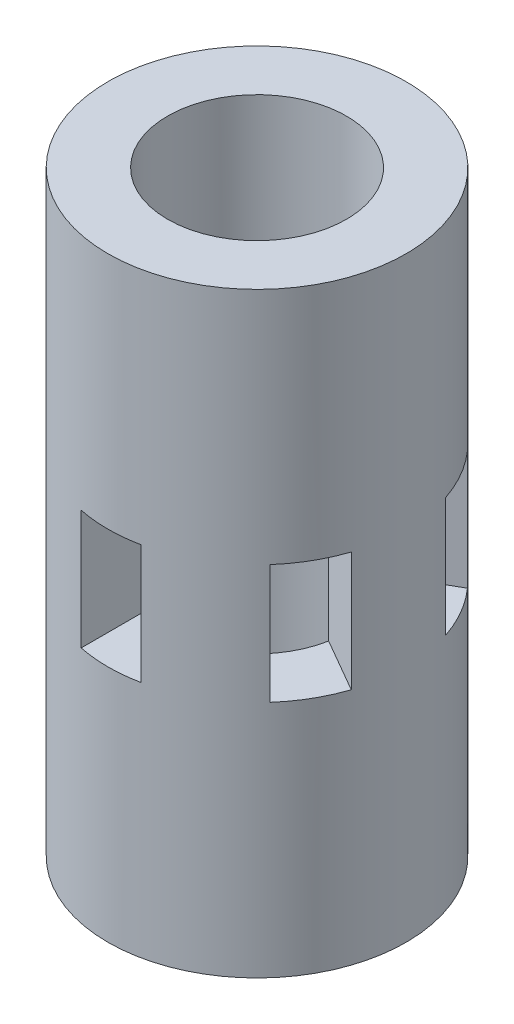
ISO-10303-21;
HEADER;
FILE_DESCRIPTION(('STEP AP214'),'2;1');
FILE_NAME('part.step','',(''),(''),'','','');
FILE_SCHEMA(('AUTOMOTIVE_DESIGN { 1 0 10303 214 1 1 1 1 }'));
ENDSEC;
DATA;
#1=APPLICATION_CONTEXT('core data for automotive mechanical design processes');
#2=APPLICATION_PROTOCOL_DEFINITION('international standard','automotive_design',2000,#1);
#3=PRODUCT_CONTEXT('',#1,'mechanical');
#4=PRODUCT('Part','Part','',(#3));
#5=PRODUCT_RELATED_PRODUCT_CATEGORY('part','',(#4));
#6=PRODUCT_DEFINITION_FORMATION('','',#4);
#7=PRODUCT_DEFINITION_CONTEXT('part definition',#1,'design');
#8=PRODUCT_DEFINITION('design','',#6,#7);
#9=PRODUCT_DEFINITION_SHAPE('','',#8);
#10=(LENGTH_UNIT() NAMED_UNIT(*) SI_UNIT(.MILLI.,.METRE.));
#11=(NAMED_UNIT(*) PLANE_ANGLE_UNIT() SI_UNIT($,.RADIAN.));
#12=(NAMED_UNIT(*) SI_UNIT($,.STERADIAN.) SOLID_ANGLE_UNIT());
#13=UNCERTAINTY_MEASURE_WITH_UNIT(LENGTH_MEASURE(1.E-05),#10,'distance_accuracy_value','');
#14=(GEOMETRIC_REPRESENTATION_CONTEXT(3) GLOBAL_UNCERTAINTY_ASSIGNED_CONTEXT((#13)) GLOBAL_UNIT_ASSIGNED_CONTEXT((#10,
#11,#12)) REPRESENTATION_CONTEXT('',''));
#15=CARTESIAN_POINT('',(0.,0.,0.));
#16=DIRECTION('',(0.,0.,1.));
#17=DIRECTION('',(1.,0.,0.));
#18=AXIS2_PLACEMENT_3D('',#15,#16,#17);
#19=CARTESIAN_POINT('',(0.,56.451612903226,0.));
#20=DIRECTION('',(0.,1.,0.));
#21=DIRECTION('',(0.,0.,1.));
#22=AXIS2_PLACEMENT_3D('',#19,#20,#21);
#23=CYLINDRICAL_SURFACE('',#22,25.);
#24=CARTESIAN_POINT('',(0.,-10.,0.));
#25=DIRECTION('',(0.,-1.,0.));
#26=DIRECTION('',(0.,0.,-1.));
#27=AXIS2_PLACEMENT_3D('',#24,#25,#26);
#28=CIRCLE('',#27,25.);
#29=CARTESIAN_POINT('',(-18.7132034355965,-10.,-16.577575732838));
#30=VERTEX_POINT('',#29);
#31=CARTESIAN_POINT('',(-23.7132034355964,-10.,-7.91732169499363));
#32=VERTEX_POINT('',#31);
#33=EDGE_CURVE('E272',#30,#32,#28,.F.);
#34=ORIENTED_EDGE('',*,*,#33,.F.);
#35=DIRECTION('',(0.,1.,0.));
#36=VECTOR('',#35,1.);
#37=CARTESIAN_POINT('',(-18.7132034355965,56.451612903226,-16.577575732838));
#38=LINE('',#37,#36);
#39=CARTESIAN_POINT('',(-18.7132034355965,10.,-16.577575732838));
#40=VERTEX_POINT('',#39);
#41=EDGE_CURVE('E315',#40,#30,#38,.F.);
#42=ORIENTED_EDGE('',*,*,#41,.F.);
#43=CARTESIAN_POINT('',(0.,10.,0.));
#44=DIRECTION('',(0.,1.,0.));
#45=DIRECTION('',(0.,0.,1.));
#46=AXIS2_PLACEMENT_3D('',#43,#44,#45);
#47=CIRCLE('',#46,25.);
#48=CARTESIAN_POINT('',(-23.7132034355965,10.,-7.91732169499364));
#49=VERTEX_POINT('',#48);
#50=EDGE_CURVE('E288',#49,#40,#47,.F.);
#51=ORIENTED_EDGE('',*,*,#50,.F.);
#52=DIRECTION('',(0.,1.,0.));
#53=VECTOR('',#52,1.);
#54=CARTESIAN_POINT('',(-23.7132034355964,56.451612903226,-7.91732169499363));
#55=LINE('',#54,#53);
#56=EDGE_CURVE('E309',#32,#49,#55,.T.);
#57=ORIENTED_EDGE('',*,*,#56,.F.);
#58=EDGE_LOOP('',(#34,#42,#51,#57));
#59=FACE_BOUND('',#58,.T.);
#60=DIRECTION('',(0.,1.,0.));
#61=VECTOR('',#60,1.);
#62=CARTESIAN_POINT('',(-23.7132034355964,56.451612903226,7.91732169499382));
#63=LINE('',#62,#61);
#64=CARTESIAN_POINT('',(-23.7132034355964,10.,7.91732169499381));
#65=VERTEX_POINT('',#64);
#66=CARTESIAN_POINT('',(-23.7132034355964,-10.,7.9173216949938));
#67=VERTEX_POINT('',#66);
#68=EDGE_CURVE('E305',#65,#67,#63,.F.);
#69=ORIENTED_EDGE('',*,*,#68,.F.);
#70=CARTESIAN_POINT('',(-18.7132034355963,10.,16.5775757328382));
#71=VERTEX_POINT('',#70);
#72=EDGE_CURVE('E314',#71,#65,#47,.F.);
#73=ORIENTED_EDGE('',*,*,#72,.F.);
#74=DIRECTION('',(0.,1.,0.));
#75=VECTOR('',#74,1.);
#76=CARTESIAN_POINT('',(-18.7132034355963,56.451612903226,16.5775757328382));
#77=LINE('',#76,#75);
#78=CARTESIAN_POINT('',(-18.7132034355963,-10.,16.5775757328382));
#79=VERTEX_POINT('',#78);
#80=EDGE_CURVE('E303',#79,#71,#77,.T.);
#81=ORIENTED_EDGE('',*,*,#80,.F.);
#82=EDGE_CURVE('E823',#67,#79,#28,.F.);
#83=ORIENTED_EDGE('',*,*,#82,.F.);
#84=EDGE_LOOP('',(#69,#73,#81,#83));
#85=FACE_BOUND('',#84,.T.);
#86=DIRECTION('',(0.,1.,0.));
#87=VECTOR('',#86,1.);
#88=CARTESIAN_POINT('',(-4.99999999999999,56.451612903226,24.4948974278318));
#89=LINE('',#88,#87);
#90=CARTESIAN_POINT('',(-5.,10.,24.4948974278318));
#91=VERTEX_POINT('',#90);
#92=CARTESIAN_POINT('',(-5.,-10.,24.4948974278318));
#93=VERTEX_POINT('',#92);
#94=EDGE_CURVE('E301',#91,#93,#89,.F.);
#95=ORIENTED_EDGE('',*,*,#94,.F.);
#96=CARTESIAN_POINT('',(5.,10.,24.4948974278318));
#97=VERTEX_POINT('',#96);
#98=EDGE_CURVE('E311',#97,#91,#47,.F.);
#99=ORIENTED_EDGE('',*,*,#98,.F.);
#100=DIRECTION('',(0.,1.,0.));
#101=VECTOR('',#100,1.);
#102=CARTESIAN_POINT('',(5.00000000000001,56.451612903226,24.4948974278318));
#103=LINE('',#102,#101);
#104=CARTESIAN_POINT('',(5.00000000000001,-10.,24.4948974278318));
#105=VERTEX_POINT('',#104);
#106=EDGE_CURVE('E299',#105,#97,#103,.T.);
#107=ORIENTED_EDGE('',*,*,#106,.F.);
#108=EDGE_CURVE('E463',#93,#105,#28,.F.);
#109=ORIENTED_EDGE('',*,*,#108,.F.);
#110=EDGE_LOOP('',(#95,#99,#107,#109));
#111=FACE_BOUND('',#110,.T.);
#112=DIRECTION('',(0.,1.,0.));
#113=VECTOR('',#112,1.);
#114=CARTESIAN_POINT('',(18.7132034355966,56.451612903226,16.5775757328379));
#115=LINE('',#114,#113);
#116=CARTESIAN_POINT('',(18.7132034355966,10.,16.5775757328379));
#117=VERTEX_POINT('',#116);
#118=CARTESIAN_POINT('',(18.7132034355966,-10.,16.5775757328379));
#119=VERTEX_POINT('',#118);
#120=EDGE_CURVE('E297',#117,#119,#115,.F.);
#121=ORIENTED_EDGE('',*,*,#120,.F.);
#122=CARTESIAN_POINT('',(23.7132034355965,10.,7.91732169499347));
#123=VERTEX_POINT('',#122);
#124=EDGE_CURVE('E313',#123,#117,#47,.F.);
#125=ORIENTED_EDGE('',*,*,#124,.F.);
#126=DIRECTION('',(0.,1.,0.));
#127=VECTOR('',#126,1.);
#128=CARTESIAN_POINT('',(23.7132034355965,56.451612903226,7.91732169499346));
#129=LINE('',#128,#127);
#130=CARTESIAN_POINT('',(23.7132034355965,-10.,7.91732169499346));
#131=VERTEX_POINT('',#130);
#132=EDGE_CURVE('E295',#131,#123,#129,.T.);
#133=ORIENTED_EDGE('',*,*,#132,.F.);
#134=EDGE_CURVE('E319',#119,#131,#28,.F.);
#135=ORIENTED_EDGE('',*,*,#134,.F.);
#136=EDGE_LOOP('',(#121,#125,#133,#135));
#137=FACE_BOUND('',#136,.T.);
#138=DIRECTION('',(0.,1.,0.));
#139=VECTOR('',#138,1.);
#140=CARTESIAN_POINT('',(18.7132034355964,56.451612903226,-16.5775757328382));
#141=LINE('',#140,#139);
#142=CARTESIAN_POINT('',(18.7132034355964,-10.,-16.5775757328382));
#143=VERTEX_POINT('',#142);
#144=CARTESIAN_POINT('',(18.7132034355964,10.,-16.5775757328382));
#145=VERTEX_POINT('',#144);
#146=EDGE_CURVE('E307',#143,#145,#141,.T.);
#147=ORIENTED_EDGE('',*,*,#146,.F.);
#148=CARTESIAN_POINT('',(23.7132034355963,-10.,-7.91732169499397));
#149=VERTEX_POINT('',#148);
#150=EDGE_CURVE('E317',#149,#143,#28,.F.);
#151=ORIENTED_EDGE('',*,*,#150,.F.);
#152=DIRECTION('',(0.,1.,0.));
#153=VECTOR('',#152,1.);
#154=CARTESIAN_POINT('',(23.7132034355963,56.451612903226,-7.91732169499399));
#155=LINE('',#154,#153);
#156=CARTESIAN_POINT('',(23.7132034355963,10.,-7.91732169499399));
#157=VERTEX_POINT('',#156);
#158=EDGE_CURVE('E274',#157,#149,#155,.F.);
#159=ORIENTED_EDGE('',*,*,#158,.F.);
#160=EDGE_CURVE('E214',#145,#157,#47,.F.);
#161=ORIENTED_EDGE('',*,*,#160,.F.);
#162=EDGE_LOOP('',(#147,#151,#159,#161));
#163=FACE_BOUND('',#162,.T.);
#164=CARTESIAN_POINT('',(0.,-10.,0.));
#165=DIRECTION('',(0.,-1.,0.));
#166=DIRECTION('',(0.,0.,-1.));
#167=AXIS2_PLACEMENT_3D('',#164,#165,#166);
#168=CIRCLE('',#167,25.);
#169=CARTESIAN_POINT('',(5.,-10.,-24.4948974278318));
#170=VERTEX_POINT('',#169);
#171=CARTESIAN_POINT('',(-5.00000000000001,-10.,-24.4948974278318));
#172=VERTEX_POINT('',#171);
#173=EDGE_CURVE('E337',#170,#172,#168,.F.);
#174=ORIENTED_EDGE('',*,*,#173,.F.);
#175=DIRECTION('',(0.,1.,0.));
#176=VECTOR('',#175,1.);
#177=CARTESIAN_POINT('',(4.99999999999999,56.451612903226,-24.4948974278318));
#178=LINE('',#177,#176);
#179=CARTESIAN_POINT('',(5.,10.,-24.4948974278318));
#180=VERTEX_POINT('',#179);
#181=EDGE_CURVE('E335',#180,#170,#178,.F.);
#182=ORIENTED_EDGE('',*,*,#181,.F.);
#183=CARTESIAN_POINT('',(0.,10.,0.));
#184=DIRECTION('',(0.,1.,0.));
#185=DIRECTION('',(0.,0.,1.));
#186=AXIS2_PLACEMENT_3D('',#183,#184,#185);
#187=CIRCLE('',#186,25.);
#188=CARTESIAN_POINT('',(-5.,10.,-24.4948974278318));
#189=VERTEX_POINT('',#188);
#190=EDGE_CURVE('E333',#189,#180,#187,.F.);
#191=ORIENTED_EDGE('',*,*,#190,.F.);
#192=DIRECTION('',(0.,1.,0.));
#193=VECTOR('',#192,1.);
#194=CARTESIAN_POINT('',(-5.00000000000001,56.451612903226,-24.4948974278318));
#195=LINE('',#194,#193);
#196=EDGE_CURVE('E331',#172,#189,#195,.T.);
#197=ORIENTED_EDGE('',*,*,#196,.F.);
#198=EDGE_LOOP('',(#174,#182,#191,#197));
#199=FACE_BOUND('',#198,.T.);
#200=CARTESIAN_POINT('',(0.,-50.,0.));
#201=DIRECTION('',(0.,1.,0.));
#202=DIRECTION('',(0.,0.,1.));
#203=AXIS2_PLACEMENT_3D('',#200,#201,#202);
#204=CIRCLE('',#203,25.);
#205=CARTESIAN_POINT('',(0.,-50.,25.));
#206=VERTEX_POINT('',#205);
#207=EDGE_CURVE('E349',#206,#206,#204,.T.);
#208=ORIENTED_EDGE('',*,*,#207,.T.);
#209=EDGE_LOOP('',(#208));
#210=FACE_BOUND('',#209,.T.);
#211=CARTESIAN_POINT('',(0.,50.,0.));
#212=DIRECTION('',(0.,1.,0.));
#213=DIRECTION('',(0.,0.,1.));
#214=AXIS2_PLACEMENT_3D('',#211,#212,#213);
#215=CIRCLE('',#214,25.);
#216=CARTESIAN_POINT('',(0.,50.,25.));
#217=VERTEX_POINT('',#216);
#218=EDGE_CURVE('E340',#217,#217,#215,.T.);
#219=ORIENTED_EDGE('',*,*,#218,.F.);
#220=EDGE_LOOP('',(#219));
#221=FACE_BOUND('',#220,.T.);
#222=ADVANCED_FACE('F34',(#59,#85,#111,#137,#163,#199,#210,#221),#23,.T.);
#223=CARTESIAN_POINT('',(-15.,-50.,0.));
#224=DIRECTION('',(0.,-1.,0.));
#225=DIRECTION('',(0.,0.,-1.));
#226=AXIS2_PLACEMENT_3D('',#223,#224,#225);
#227=PLANE('',#226);
#228=CARTESIAN_POINT('',(0.,-50.,0.));
#229=DIRECTION('',(0.,1.,0.));
#230=DIRECTION('',(0.,0.,1.));
#231=AXIS2_PLACEMENT_3D('',#228,#229,#230);
#232=CIRCLE('',#231,15.);
#233=CARTESIAN_POINT('',(0.,-50.,15.));
#234=VERTEX_POINT('',#233);
#235=EDGE_CURVE('E346',#234,#234,#232,.T.);
#236=ORIENTED_EDGE('',*,*,#235,.T.);
#237=EDGE_LOOP('',(#236));
#238=FACE_BOUND('',#237,.T.);
#239=ORIENTED_EDGE('',*,*,#207,.F.);
#240=EDGE_LOOP('',(#239));
#241=FACE_BOUND('',#240,.T.);
#242=ADVANCED_FACE('F392',(#238,#241),#227,.T.);
#243=CARTESIAN_POINT('',(0.,56.451612903226,0.));
#244=DIRECTION('',(0.,1.,0.));
#245=DIRECTION('',(0.,0.,1.));
#246=AXIS2_PLACEMENT_3D('',#243,#244,#245);
#247=CYLINDRICAL_SURFACE('',#246,15.);
#248=CARTESIAN_POINT('',(0.,-10.,0.));
#249=DIRECTION('',(0.,-1.,0.));
#250=DIRECTION('',(0.,0.,-1.));
#251=AXIS2_PLACEMENT_3D('',#248,#249,#250);
#252=CIRCLE('',#251,15.);
#253=CARTESIAN_POINT('',(-14.7474487139159,-10.,-2.74094079294324));
#254=VERTEX_POINT('',#253);
#255=CARTESIAN_POINT('',(-9.74744871391592,-10.,-11.4011948307876));
#256=VERTEX_POINT('',#255);
#257=EDGE_CURVE('E12',#254,#256,#252,.T.);
#258=ORIENTED_EDGE('',*,*,#257,.F.);
#259=DIRECTION('',(0.,1.,0.));
#260=VECTOR('',#259,1.);
#261=CARTESIAN_POINT('',(-14.7474487139159,56.451612903226,-2.74094079294324));
#262=LINE('',#261,#260);
#263=CARTESIAN_POINT('',(-14.7474487139159,10.,-2.74094079294324));
#264=VERTEX_POINT('',#263);
#265=EDGE_CURVE('E227',#264,#254,#262,.F.);
#266=ORIENTED_EDGE('',*,*,#265,.F.);
#267=CARTESIAN_POINT('',(0.,10.,0.));
#268=DIRECTION('',(0.,1.,0.));
#269=DIRECTION('',(0.,0.,1.));
#270=AXIS2_PLACEMENT_3D('',#267,#268,#269);
#271=CIRCLE('',#270,15.);
#272=CARTESIAN_POINT('',(-9.74744871391592,10.,-11.4011948307876));
#273=VERTEX_POINT('',#272);
#274=EDGE_CURVE('E223',#273,#264,#271,.T.);
#275=ORIENTED_EDGE('',*,*,#274,.F.);
#276=DIRECTION('',(0.,1.,0.));
#277=VECTOR('',#276,1.);
#278=CARTESIAN_POINT('',(-9.74744871391593,56.451612903226,-11.4011948307876));
#279=LINE('',#278,#277);
#280=EDGE_CURVE('E37',#256,#273,#279,.T.);
#281=ORIENTED_EDGE('',*,*,#280,.F.);
#282=EDGE_LOOP('',(#258,#266,#275,#281));
#283=FACE_BOUND('',#282,.T.);
#284=DIRECTION('',(0.,1.,0.));
#285=VECTOR('',#284,1.);
#286=CARTESIAN_POINT('',(-14.7474487139159,56.451612903226,2.74094079294336));
#287=LINE('',#286,#285);
#288=CARTESIAN_POINT('',(-14.7474487139159,-10.,2.74094079294335));
#289=VERTEX_POINT('',#288);
#290=CARTESIAN_POINT('',(-14.7474487139159,10.,2.74094079294335));
#291=VERTEX_POINT('',#290);
#292=EDGE_CURVE('E256',#289,#291,#287,.T.);
#293=ORIENTED_EDGE('',*,*,#292,.F.);
#294=CARTESIAN_POINT('',(-9.74744871391584,-10.,11.4011948307877));
#295=VERTEX_POINT('',#294);
#296=EDGE_CURVE('E43',#295,#289,#252,.T.);
#297=ORIENTED_EDGE('',*,*,#296,.F.);
#298=DIRECTION('',(0.,1.,0.));
#299=VECTOR('',#298,1.);
#300=CARTESIAN_POINT('',(-9.74744871391584,56.451612903226,11.4011948307877));
#301=LINE('',#300,#299);
#302=CARTESIAN_POINT('',(-9.74744871391584,10.,11.4011948307877));
#303=VERTEX_POINT('',#302);
#304=EDGE_CURVE('E250',#303,#295,#301,.F.);
#305=ORIENTED_EDGE('',*,*,#304,.F.);
#306=EDGE_CURVE('E228',#291,#303,#271,.T.);
#307=ORIENTED_EDGE('',*,*,#306,.F.);
#308=EDGE_LOOP('',(#293,#297,#305,#307));
#309=FACE_BOUND('',#308,.T.);
#310=DIRECTION('',(0.,1.,0.));
#311=VECTOR('',#310,1.);
#312=CARTESIAN_POINT('',(-4.99999999999999,56.451612903226,14.142135623731));
#313=LINE('',#312,#311);
#314=CARTESIAN_POINT('',(-5.,-10.,14.1421356237309));
#315=VERTEX_POINT('',#314);
#316=CARTESIAN_POINT('',(-5.,10.,14.1421356237309));
#317=VERTEX_POINT('',#316);
#318=EDGE_CURVE('E247',#315,#317,#313,.T.);
#319=ORIENTED_EDGE('',*,*,#318,.F.);
#320=CARTESIAN_POINT('',(5.,-10.,14.1421356237309));
#321=VERTEX_POINT('',#320);
#322=EDGE_CURVE('E238',#321,#315,#252,.T.);
#323=ORIENTED_EDGE('',*,*,#322,.F.);
#324=DIRECTION('',(0.,1.,0.));
#325=VECTOR('',#324,1.);
#326=CARTESIAN_POINT('',(5.00000000000001,56.451612903226,14.1421356237309));
#327=LINE('',#326,#325);
#328=CARTESIAN_POINT('',(5.00000000000001,10.,14.1421356237309));
#329=VERTEX_POINT('',#328);
#330=EDGE_CURVE('E241',#329,#321,#327,.F.);
#331=ORIENTED_EDGE('',*,*,#330,.F.);
#332=EDGE_CURVE('E231',#317,#329,#271,.T.);
#333=ORIENTED_EDGE('',*,*,#332,.F.);
#334=EDGE_LOOP('',(#319,#323,#331,#333));
#335=FACE_BOUND('',#334,.T.);
#336=DIRECTION('',(0.,1.,0.));
#337=VECTOR('',#336,1.);
#338=CARTESIAN_POINT('',(9.74744871391601,56.451612903226,11.4011948307876));
#339=LINE('',#338,#337);
#340=CARTESIAN_POINT('',(9.747448713916,-10.,11.4011948307876));
#341=VERTEX_POINT('',#340);
#342=CARTESIAN_POINT('',(9.747448713916,10.,11.4011948307876));
#343=VERTEX_POINT('',#342);
#344=EDGE_CURVE('E237',#341,#343,#339,.T.);
#345=ORIENTED_EDGE('',*,*,#344,.F.);
#346=CARTESIAN_POINT('',(14.7474487139159,-10.,2.74094079294315));
#347=VERTEX_POINT('',#346);
#348=EDGE_CURVE('E225',#347,#341,#252,.T.);
#349=ORIENTED_EDGE('',*,*,#348,.F.);
#350=DIRECTION('',(0.,1.,0.));
#351=VECTOR('',#350,1.);
#352=CARTESIAN_POINT('',(14.7474487139159,56.451612903226,2.74094079294313));
#353=LINE('',#352,#351);
#354=CARTESIAN_POINT('',(14.7474487139159,10.,2.74094079294313));
#355=VERTEX_POINT('',#354);
#356=EDGE_CURVE('E230',#355,#347,#353,.F.);
#357=ORIENTED_EDGE('',*,*,#356,.F.);
#358=EDGE_CURVE('E224',#343,#355,#271,.T.);
#359=ORIENTED_EDGE('',*,*,#358,.F.);
#360=EDGE_LOOP('',(#345,#349,#357,#359));
#361=FACE_BOUND('',#360,.T.);
#362=DIRECTION('',(0.,1.,0.));
#363=VECTOR('',#362,1.);
#364=CARTESIAN_POINT('',(9.74744871391585,56.451612903226,-11.4011948307877));
#365=LINE('',#364,#363);
#366=CARTESIAN_POINT('',(9.74744871391585,10.,-11.4011948307877));
#367=VERTEX_POINT('',#366);
#368=CARTESIAN_POINT('',(9.74744871391585,-10.,-11.4011948307877));
#369=VERTEX_POINT('',#368);
#370=EDGE_CURVE('E221',#367,#369,#365,.F.);
#371=ORIENTED_EDGE('',*,*,#370,.F.);
#372=CARTESIAN_POINT('',(14.7474487139159,10.,-2.74094079294345));
#373=VERTEX_POINT('',#372);
#374=EDGE_CURVE('E206',#373,#367,#271,.T.);
#375=ORIENTED_EDGE('',*,*,#374,.F.);
#376=DIRECTION('',(0.,1.,0.));
#377=VECTOR('',#376,1.);
#378=CARTESIAN_POINT('',(14.7474487139159,56.451612903226,-2.74094079294347));
#379=LINE('',#378,#377);
#380=CARTESIAN_POINT('',(14.7474487139159,-10.,-2.74094079294347));
#381=VERTEX_POINT('',#380);
#382=EDGE_CURVE('E195',#381,#373,#379,.T.);
#383=ORIENTED_EDGE('',*,*,#382,.F.);
#384=EDGE_CURVE('E44',#369,#381,#252,.T.);
#385=ORIENTED_EDGE('',*,*,#384,.F.);
#386=EDGE_LOOP('',(#371,#375,#383,#385));
#387=FACE_BOUND('',#386,.T.);
#388=CARTESIAN_POINT('',(0.,-10.,0.));
#389=DIRECTION('',(0.,-1.,0.));
#390=DIRECTION('',(0.,0.,-1.));
#391=AXIS2_PLACEMENT_3D('',#388,#389,#390);
#392=CIRCLE('',#391,15.);
#393=CARTESIAN_POINT('',(-5.,-10.,-14.1421356237309));
#394=VERTEX_POINT('',#393);
#395=CARTESIAN_POINT('',(5.,-10.,-14.1421356237309));
#396=VERTEX_POINT('',#395);
#397=EDGE_CURVE('E207',#394,#396,#392,.T.);
#398=ORIENTED_EDGE('',*,*,#397,.F.);
#399=DIRECTION('',(0.,1.,0.));
#400=VECTOR('',#399,1.);
#401=CARTESIAN_POINT('',(-5.00000000000001,56.451612903226,-14.1421356237309));
#402=LINE('',#401,#400);
#403=CARTESIAN_POINT('',(-5.00000000000001,10.,-14.1421356237309));
#404=VERTEX_POINT('',#403);
#405=EDGE_CURVE('E352',#404,#394,#402,.F.);
#406=ORIENTED_EDGE('',*,*,#405,.F.);
#407=CARTESIAN_POINT('',(0.,10.,0.));
#408=DIRECTION('',(0.,1.,0.));
#409=DIRECTION('',(0.,0.,1.));
#410=AXIS2_PLACEMENT_3D('',#407,#408,#409);
#411=CIRCLE('',#410,15.);
#412=CARTESIAN_POINT('',(5.,10.,-14.142135623731));
#413=VERTEX_POINT('',#412);
#414=EDGE_CURVE('E354',#413,#404,#411,.T.);
#415=ORIENTED_EDGE('',*,*,#414,.F.);
#416=DIRECTION('',(0.,1.,0.));
#417=VECTOR('',#416,1.);
#418=CARTESIAN_POINT('',(4.99999999999999,56.451612903226,-14.142135623731));
#419=LINE('',#418,#417);
#420=EDGE_CURVE('E357',#396,#413,#419,.T.);
#421=ORIENTED_EDGE('',*,*,#420,.F.);
#422=EDGE_LOOP('',(#398,#406,#415,#421));
#423=FACE_BOUND('',#422,.T.);
#424=CARTESIAN_POINT('',(0.,50.,0.));
#425=DIRECTION('',(0.,1.,0.));
#426=DIRECTION('',(0.,0.,1.));
#427=AXIS2_PLACEMENT_3D('',#424,#425,#426);
#428=CIRCLE('',#427,15.);
#429=CARTESIAN_POINT('',(0.,50.,15.));
#430=VERTEX_POINT('',#429);
#431=EDGE_CURVE('E343',#430,#430,#428,.T.);
#432=ORIENTED_EDGE('',*,*,#431,.T.);
#433=EDGE_LOOP('',(#432));
#434=FACE_BOUND('',#433,.T.);
#435=ORIENTED_EDGE('',*,*,#235,.F.);
#436=EDGE_LOOP('',(#435));
#437=FACE_BOUND('',#436,.T.);
#438=ADVANCED_FACE('F219',(#283,#309,#335,#361,#387,#423,#434,#437),#247,.F.);
#439=CARTESIAN_POINT('',(-15.,50.,0.));
#440=DIRECTION('',(0.,1.,0.));
#441=DIRECTION('',(0.,0.,1.));
#442=AXIS2_PLACEMENT_3D('',#439,#440,#441);
#443=PLANE('',#442);
#444=ORIENTED_EDGE('',*,*,#218,.T.);
#445=EDGE_LOOP('',(#444));
#446=FACE_BOUND('',#445,.T.);
#447=ORIENTED_EDGE('',*,*,#431,.F.);
#448=EDGE_LOOP('',(#447));
#449=FACE_BOUND('',#448,.T.);
#450=ADVANCED_FACE('F522',(#446,#449),#443,.T.);
#451=CARTESIAN_POINT('',(5.,-10.,-57.001));
#452=DIRECTION('',(0.,-1.,0.));
#453=DIRECTION('',(0.,0.,-1.));
#454=AXIS2_PLACEMENT_3D('',#451,#452,#453);
#455=PLANE('',#454);
#456=ORIENTED_EDGE('',*,*,#173,.T.);
#457=DIRECTION('',(0.,0.,1.));
#458=VECTOR('',#457,1.);
#459=CARTESIAN_POINT('',(-5.,-10.,-57.001));
#460=LINE('',#459,#458);
#461=EDGE_CURVE('E322',#172,#394,#460,.T.);
#462=ORIENTED_EDGE('',*,*,#461,.T.);
#463=ORIENTED_EDGE('',*,*,#397,.T.);
#464=DIRECTION('',(0.,0.,1.));
#465=VECTOR('',#464,1.);
#466=CARTESIAN_POINT('',(5.,-10.,-57.001));
#467=LINE('',#466,#465);
#468=EDGE_CURVE('E326',#170,#396,#467,.T.);
#469=ORIENTED_EDGE('',*,*,#468,.F.);
#470=EDGE_LOOP('',(#456,#462,#463,#469));
#471=FACE_BOUND('',#470,.T.);
#472=ADVANCED_FACE('F362',(#471),#455,.F.);
#473=CARTESIAN_POINT('',(5.,10.,-57.001));
#474=DIRECTION('',(1.,0.,0.));
#475=DIRECTION('',(0.,1.,0.));
#476=AXIS2_PLACEMENT_3D('',#473,#474,#475);
#477=PLANE('',#476);
#478=ORIENTED_EDGE('',*,*,#181,.T.);
#479=ORIENTED_EDGE('',*,*,#468,.T.);
#480=ORIENTED_EDGE('',*,*,#420,.T.);
#481=DIRECTION('',(0.,0.,1.));
#482=VECTOR('',#481,1.);
#483=CARTESIAN_POINT('',(5.,10.,-57.001));
#484=LINE('',#483,#482);
#485=EDGE_CURVE('E323',#180,#413,#484,.T.);
#486=ORIENTED_EDGE('',*,*,#485,.F.);
#487=EDGE_LOOP('',(#478,#479,#480,#486));
#488=FACE_BOUND('',#487,.T.);
#489=ADVANCED_FACE('F367',(#488),#477,.F.);
#490=CARTESIAN_POINT('',(5.,10.,-57.001));
#491=DIRECTION('',(0.,1.,0.));
#492=DIRECTION('',(0.,0.,1.));
#493=AXIS2_PLACEMENT_3D('',#490,#491,#492);
#494=PLANE('',#493);
#495=ORIENTED_EDGE('',*,*,#190,.T.);
#496=ORIENTED_EDGE('',*,*,#485,.T.);
#497=ORIENTED_EDGE('',*,*,#414,.T.);
#498=DIRECTION('',(0.,0.,1.));
#499=VECTOR('',#498,1.);
#500=CARTESIAN_POINT('',(-5.,10.,-57.001));
#501=LINE('',#500,#499);
#502=EDGE_CURVE('E320',#189,#404,#501,.T.);
#503=ORIENTED_EDGE('',*,*,#502,.F.);
#504=EDGE_LOOP('',(#495,#496,#497,#503));
#505=FACE_BOUND('',#504,.T.);
#506=ADVANCED_FACE('F374',(#505),#494,.F.);
#507=CARTESIAN_POINT('',(-5.,10.,-57.001));
#508=DIRECTION('',(-1.,0.,0.));
#509=DIRECTION('',(0.,-1.,0.));
#510=AXIS2_PLACEMENT_3D('',#507,#508,#509);
#511=PLANE('',#510);
#512=ORIENTED_EDGE('',*,*,#196,.T.);
#513=ORIENTED_EDGE('',*,*,#502,.T.);
#514=ORIENTED_EDGE('',*,*,#405,.T.);
#515=ORIENTED_EDGE('',*,*,#461,.F.);
#516=EDGE_LOOP('',(#512,#513,#514,#515));
#517=FACE_BOUND('',#516,.T.);
#518=ADVANCED_FACE('F380',(#517),#511,.F.);
#519=CARTESIAN_POINT('',(64.8611102508337,10.,-31.6740767713615));
#520=DIRECTION('',(0.50000000000001,0.,0.866025403784433));
#521=DIRECTION('',(0.866025403784433,0.,-0.50000000000001));
#522=AXIS2_PLACEMENT_3D('',#519,#520,#521);
#523=PLANE('',#522);
#524=ORIENTED_EDGE('',*,*,#158,.T.);
#525=DIRECTION('',(-0.866025403784433,0.,0.50000000000001));
#526=VECTOR('',#525,1.);
#527=CARTESIAN_POINT('',(64.8611102508337,-10.,-31.6740767713615));
#528=LINE('',#527,#526);
#529=EDGE_CURVE('E201',#149,#381,#528,.T.);
#530=ORIENTED_EDGE('',*,*,#529,.T.);
#531=ORIENTED_EDGE('',*,*,#382,.T.);
#532=DIRECTION('',(-0.866025403784433,0.,0.50000000000001));
#533=VECTOR('',#532,1.);
#534=CARTESIAN_POINT('',(64.8611102508337,10.,-31.6740767713615));
#535=LINE('',#534,#533);
#536=EDGE_CURVE('E198',#157,#373,#535,.T.);
#537=ORIENTED_EDGE('',*,*,#536,.F.);
#538=EDGE_LOOP('',(#524,#530,#531,#537));
#539=FACE_BOUND('',#538,.T.);
#540=ADVANCED_FACE('F197',(#539),#523,.F.);
#541=CARTESIAN_POINT('',(-64.8611102508338,10.,31.674076771361));
#542=DIRECTION('',(-0.500000000000004,0.,-0.866025403784436));
#543=DIRECTION('',(-0.866025403784436,0.,0.500000000000004));
#544=AXIS2_PLACEMENT_3D('',#541,#542,#543);
#545=PLANE('',#544);
#546=ORIENTED_EDGE('',*,*,#146,.T.);
#547=DIRECTION('',(0.866025403784436,0.,-0.500000000000004));
#548=VECTOR('',#547,1.);
#549=CARTESIAN_POINT('',(-64.8611102508338,10.,31.674076771361));
#550=LINE('',#549,#548);
#551=EDGE_CURVE('E415',#367,#145,#550,.T.);
#552=ORIENTED_EDGE('',*,*,#551,.F.);
#553=ORIENTED_EDGE('',*,*,#370,.T.);
#554=DIRECTION('',(0.866025403784436,0.,-0.500000000000004));
#555=VECTOR('',#554,1.);
#556=CARTESIAN_POINT('',(-64.8611102508338,-10.,31.674076771361));
#557=LINE('',#556,#555);
#558=EDGE_CURVE('E417',#369,#143,#557,.T.);
#559=ORIENTED_EDGE('',*,*,#558,.T.);
#560=EDGE_LOOP('',(#546,#552,#553,#559));
#561=FACE_BOUND('',#560,.T.);
#562=ADVANCED_FACE('F387',(#561),#545,.F.);
#563=CARTESIAN_POINT('',(-59.861110250834,10.,-40.3343308092049));
#564=DIRECTION('',(0.,1.,0.));
#565=DIRECTION('',(0.,0.,1.));
#566=AXIS2_PLACEMENT_3D('',#563,#564,#565);
#567=PLANE('',#566);
#568=ORIENTED_EDGE('',*,*,#160,.T.);
#569=ORIENTED_EDGE('',*,*,#536,.T.);
#570=ORIENTED_EDGE('',*,*,#374,.T.);
#571=ORIENTED_EDGE('',*,*,#551,.T.);
#572=EDGE_LOOP('',(#568,#569,#570,#571));
#573=FACE_BOUND('',#572,.T.);
#574=ADVANCED_FACE('F210',(#573),#567,.F.);
#575=CARTESIAN_POINT('',(-59.861110250834,-10.,-40.3343308092049));
#576=DIRECTION('',(0.,-1.,0.));
#577=DIRECTION('',(0.,0.,-1.));
#578=AXIS2_PLACEMENT_3D('',#575,#576,#577);
#579=PLANE('',#578);
#580=ORIENTED_EDGE('',*,*,#150,.T.);
#581=ORIENTED_EDGE('',*,*,#558,.F.);
#582=ORIENTED_EDGE('',*,*,#384,.T.);
#583=ORIENTED_EDGE('',*,*,#529,.F.);
#584=EDGE_LOOP('',(#580,#581,#582,#583));
#585=FACE_BOUND('',#584,.T.);
#586=ADVANCED_FACE('F496',(#585),#579,.F.);
#587=CARTESIAN_POINT('',(59.8611102508342,10.,40.3343308092044));
#588=DIRECTION('',(-0.499999999999992,0.,0.866025403784443));
#589=DIRECTION('',(0.866025403784443,0.,0.499999999999992));
#590=AXIS2_PLACEMENT_3D('',#587,#588,#589);
#591=PLANE('',#590);
#592=ORIENTED_EDGE('',*,*,#120,.T.);
#593=DIRECTION('',(-0.866025403784443,0.,-0.499999999999992));
#594=VECTOR('',#593,1.);
#595=CARTESIAN_POINT('',(59.8611102508342,-10.,40.3343308092045));
#596=LINE('',#595,#594);
#597=EDGE_CURVE('E216',#119,#341,#596,.T.);
#598=ORIENTED_EDGE('',*,*,#597,.T.);
#599=ORIENTED_EDGE('',*,*,#344,.T.);
#600=DIRECTION('',(-0.866025403784443,0.,-0.499999999999992));
#601=VECTOR('',#600,1.);
#602=CARTESIAN_POINT('',(59.8611102508342,10.,40.3343308092044));
#603=LINE('',#602,#601);
#604=EDGE_CURVE('E435',#117,#343,#603,.T.);
#605=ORIENTED_EDGE('',*,*,#604,.F.);
#606=EDGE_LOOP('',(#592,#598,#599,#605));
#607=FACE_BOUND('',#606,.T.);
#608=ADVANCED_FACE('F439',(#607),#591,.F.);
#609=CARTESIAN_POINT('',(64.8611102508341,10.,31.67407677136));
#610=DIRECTION('',(0.499999999999992,0.,-0.866025403784443));
#611=DIRECTION('',(-0.866025403784443,0.,-0.499999999999992));
#612=AXIS2_PLACEMENT_3D('',#609,#610,#611);
#613=PLANE('',#612);
#614=ORIENTED_EDGE('',*,*,#132,.T.);
#615=DIRECTION('',(-0.866025403784443,0.,-0.499999999999992));
#616=VECTOR('',#615,1.);
#617=CARTESIAN_POINT('',(64.8611102508341,10.,31.67407677136));
#618=LINE('',#617,#616);
#619=EDGE_CURVE('E436',#123,#355,#618,.T.);
#620=ORIENTED_EDGE('',*,*,#619,.T.);
#621=ORIENTED_EDGE('',*,*,#356,.T.);
#622=DIRECTION('',(-0.866025403784443,0.,-0.499999999999992));
#623=VECTOR('',#622,1.);
#624=CARTESIAN_POINT('',(64.8611102508341,-10.,31.67407677136));
#625=LINE('',#624,#623);
#626=EDGE_CURVE('E444',#131,#347,#625,.T.);
#627=ORIENTED_EDGE('',*,*,#626,.F.);
#628=EDGE_LOOP('',(#614,#620,#621,#627));
#629=FACE_BOUND('',#628,.T.);
#630=ADVANCED_FACE('F515',(#629),#613,.F.);
#631=ORIENTED_EDGE('',*,*,#124,.T.);
#632=ORIENTED_EDGE('',*,*,#604,.T.);
#633=ORIENTED_EDGE('',*,*,#358,.T.);
#634=ORIENTED_EDGE('',*,*,#619,.F.);
#635=EDGE_LOOP('',(#631,#632,#633,#634));
#636=FACE_BOUND('',#635,.T.);
#637=ADVANCED_FACE('F434',(#636),#567,.F.);
#638=ORIENTED_EDGE('',*,*,#134,.T.);
#639=ORIENTED_EDGE('',*,*,#626,.T.);
#640=ORIENTED_EDGE('',*,*,#348,.T.);
#641=ORIENTED_EDGE('',*,*,#597,.F.);
#642=EDGE_LOOP('',(#638,#639,#640,#641));
#643=FACE_BOUND('',#642,.T.);
#644=ADVANCED_FACE('F481',(#643),#579,.F.);
#645=CARTESIAN_POINT('',(-5.,10.,57.001));
#646=DIRECTION('',(-1.,0.,0.));
#647=DIRECTION('',(0.,-1.,0.));
#648=AXIS2_PLACEMENT_3D('',#645,#646,#647);
#649=PLANE('',#648);
#650=ORIENTED_EDGE('',*,*,#94,.T.);
#651=DIRECTION('',(0.,0.,-1.));
#652=VECTOR('',#651,1.);
#653=CARTESIAN_POINT('',(-5.,-10.,57.001));
#654=LINE('',#653,#652);
#655=EDGE_CURVE('E451',#93,#315,#654,.T.);
#656=ORIENTED_EDGE('',*,*,#655,.T.);
#657=ORIENTED_EDGE('',*,*,#318,.T.);
#658=DIRECTION('',(0.,0.,-1.));
#659=VECTOR('',#658,1.);
#660=CARTESIAN_POINT('',(-5.,10.,57.001));
#661=LINE('',#660,#659);
#662=EDGE_CURVE('E454',#91,#317,#661,.T.);
#663=ORIENTED_EDGE('',*,*,#662,.F.);
#664=EDGE_LOOP('',(#650,#656,#657,#663));
#665=FACE_BOUND('',#664,.T.);
#666=ADVANCED_FACE('F471',(#665),#649,.F.);
#667=CARTESIAN_POINT('',(5.,10.,57.001));
#668=DIRECTION('',(1.,0.,0.));
#669=DIRECTION('',(0.,1.,0.));
#670=AXIS2_PLACEMENT_3D('',#667,#668,#669);
#671=PLANE('',#670);
#672=ORIENTED_EDGE('',*,*,#106,.T.);
#673=DIRECTION('',(0.,0.,-1.));
#674=VECTOR('',#673,1.);
#675=CARTESIAN_POINT('',(5.,10.,57.001));
#676=LINE('',#675,#674);
#677=EDGE_CURVE('E452',#97,#329,#676,.T.);
#678=ORIENTED_EDGE('',*,*,#677,.T.);
#679=ORIENTED_EDGE('',*,*,#330,.T.);
#680=DIRECTION('',(0.,0.,-1.));
#681=VECTOR('',#680,1.);
#682=CARTESIAN_POINT('',(5.,-10.,57.001));
#683=LINE('',#682,#681);
#684=EDGE_CURVE('E426',#105,#321,#683,.T.);
#685=ORIENTED_EDGE('',*,*,#684,.F.);
#686=EDGE_LOOP('',(#672,#678,#679,#685));
#687=FACE_BOUND('',#686,.T.);
#688=ADVANCED_FACE('F473',(#687),#671,.F.);
#689=ORIENTED_EDGE('',*,*,#98,.T.);
#690=ORIENTED_EDGE('',*,*,#662,.T.);
#691=ORIENTED_EDGE('',*,*,#332,.T.);
#692=ORIENTED_EDGE('',*,*,#677,.F.);
#693=EDGE_LOOP('',(#689,#690,#691,#692));
#694=FACE_BOUND('',#693,.T.);
#695=ADVANCED_FACE('F472',(#694),#567,.F.);
#696=ORIENTED_EDGE('',*,*,#108,.T.);
#697=ORIENTED_EDGE('',*,*,#684,.T.);
#698=ORIENTED_EDGE('',*,*,#322,.T.);
#699=ORIENTED_EDGE('',*,*,#655,.F.);
#700=EDGE_LOOP('',(#696,#697,#698,#699));
#701=FACE_BOUND('',#700,.T.);
#702=ADVANCED_FACE('F461',(#701),#579,.F.);
#703=ORIENTED_EDGE('',*,*,#68,.T.);
#704=EDGE_CURVE('E419',#67,#289,#557,.T.);
#705=ORIENTED_EDGE('',*,*,#704,.T.);
#706=ORIENTED_EDGE('',*,*,#292,.T.);
#707=EDGE_CURVE('E418',#65,#291,#550,.T.);
#708=ORIENTED_EDGE('',*,*,#707,.F.);
#709=EDGE_LOOP('',(#703,#705,#706,#708));
#710=FACE_BOUND('',#709,.T.);
#711=ADVANCED_FACE('F488',(#710),#545,.F.);
#712=CARTESIAN_POINT('',(-59.8611102508338,10.,40.3343308092054));
#713=DIRECTION('',(0.500000000000004,0.,0.866025403784436));
#714=DIRECTION('',(0.866025403784436,0.,-0.500000000000004));
#715=AXIS2_PLACEMENT_3D('',#712,#713,#714);
#716=PLANE('',#715);
#717=ORIENTED_EDGE('',*,*,#80,.T.);
#718=DIRECTION('',(0.866025403784436,0.,-0.500000000000004));
#719=VECTOR('',#718,1.);
#720=CARTESIAN_POINT('',(-59.8611102508338,10.,40.3343308092054));
#721=LINE('',#720,#719);
#722=EDGE_CURVE('E421',#71,#303,#721,.T.);
#723=ORIENTED_EDGE('',*,*,#722,.T.);
#724=ORIENTED_EDGE('',*,*,#304,.T.);
#725=DIRECTION('',(0.866025403784436,0.,-0.500000000000004));
#726=VECTOR('',#725,1.);
#727=CARTESIAN_POINT('',(-59.8611102508338,-10.,40.3343308092054));
#728=LINE('',#727,#726);
#729=EDGE_CURVE('E59',#79,#295,#728,.T.);
#730=ORIENTED_EDGE('',*,*,#729,.F.);
#731=EDGE_LOOP('',(#717,#723,#724,#730));
#732=FACE_BOUND('',#731,.T.);
#733=ADVANCED_FACE('F429',(#732),#716,.F.);
#734=ORIENTED_EDGE('',*,*,#72,.T.);
#735=ORIENTED_EDGE('',*,*,#707,.T.);
#736=ORIENTED_EDGE('',*,*,#306,.T.);
#737=ORIENTED_EDGE('',*,*,#722,.F.);
#738=EDGE_LOOP('',(#734,#735,#736,#737));
#739=FACE_BOUND('',#738,.T.);
#740=ADVANCED_FACE('F431',(#739),#567,.F.);
#741=ORIENTED_EDGE('',*,*,#82,.T.);
#742=ORIENTED_EDGE('',*,*,#729,.T.);
#743=ORIENTED_EDGE('',*,*,#296,.T.);
#744=ORIENTED_EDGE('',*,*,#704,.F.);
#745=EDGE_LOOP('',(#741,#742,#743,#744));
#746=FACE_BOUND('',#745,.T.);
#747=ADVANCED_FACE('F497',(#746),#579,.F.);
#748=ORIENTED_EDGE('',*,*,#50,.T.);
#749=DIRECTION('',(0.86602540378444,0.,0.499999999999998));
#750=VECTOR('',#749,1.);
#751=CARTESIAN_POINT('',(-59.861110250834,10.,-40.3343308092049));
#752=LINE('',#751,#750);
#753=EDGE_CURVE('E282',#40,#273,#752,.T.);
#754=ORIENTED_EDGE('',*,*,#753,.T.);
#755=ORIENTED_EDGE('',*,*,#274,.T.);
#756=DIRECTION('',(0.86602540378444,0.,0.499999999999998));
#757=VECTOR('',#756,1.);
#758=CARTESIAN_POINT('',(-64.8611102508339,10.,-31.6740767713605));
#759=LINE('',#758,#757);
#760=EDGE_CURVE('E263',#49,#264,#759,.T.);
#761=ORIENTED_EDGE('',*,*,#760,.F.);
#762=EDGE_LOOP('',(#748,#754,#755,#761));
#763=FACE_BOUND('',#762,.T.);
#764=ADVANCED_FACE('F286',(#763),#567,.F.);
#765=ORIENTED_EDGE('',*,*,#33,.T.);
#766=DIRECTION('',(0.86602540378444,0.,0.499999999999998));
#767=VECTOR('',#766,1.);
#768=CARTESIAN_POINT('',(-64.8611102508339,-10.,-31.6740767713605));
#769=LINE('',#768,#767);
#770=EDGE_CURVE('E51',#32,#254,#769,.T.);
#771=ORIENTED_EDGE('',*,*,#770,.T.);
#772=ORIENTED_EDGE('',*,*,#257,.T.);
#773=DIRECTION('',(0.86602540378444,0.,0.499999999999998));
#774=VECTOR('',#773,1.);
#775=CARTESIAN_POINT('',(-59.861110250834,-10.,-40.3343308092049));
#776=LINE('',#775,#774);
#777=EDGE_CURVE('E284',#30,#256,#776,.T.);
#778=ORIENTED_EDGE('',*,*,#777,.F.);
#779=EDGE_LOOP('',(#765,#771,#772,#778));
#780=FACE_BOUND('',#779,.T.);
#781=ADVANCED_FACE('F268',(#780),#579,.F.);
#782=CARTESIAN_POINT('',(-59.861110250834,10.,-40.3343308092049));
#783=DIRECTION('',(0.499999999999998,0.,-0.86602540378444));
#784=DIRECTION('',(-0.86602540378444,0.,-0.499999999999998));
#785=AXIS2_PLACEMENT_3D('',#782,#783,#784);
#786=PLANE('',#785);
#787=ORIENTED_EDGE('',*,*,#41,.T.);
#788=ORIENTED_EDGE('',*,*,#777,.T.);
#789=ORIENTED_EDGE('',*,*,#280,.T.);
#790=ORIENTED_EDGE('',*,*,#753,.F.);
#791=EDGE_LOOP('',(#787,#788,#789,#790));
#792=FACE_BOUND('',#791,.T.);
#793=ADVANCED_FACE('F281',(#792),#786,.F.);
#794=CARTESIAN_POINT('',(-64.8611102508339,10.,-31.6740767713605));
#795=DIRECTION('',(-0.499999999999998,0.,0.86602540378444));
#796=DIRECTION('',(0.86602540378444,0.,0.499999999999998));
#797=AXIS2_PLACEMENT_3D('',#794,#795,#796);
#798=PLANE('',#797);
#799=ORIENTED_EDGE('',*,*,#56,.T.);
#800=ORIENTED_EDGE('',*,*,#760,.T.);
#801=ORIENTED_EDGE('',*,*,#265,.T.);
#802=ORIENTED_EDGE('',*,*,#770,.F.);
#803=EDGE_LOOP('',(#799,#800,#801,#802));
#804=FACE_BOUND('',#803,.T.);
#805=ADVANCED_FACE('F261',(#804),#798,.F.);
#806=CLOSED_SHELL('',(#222,#242,#438,#450,#472,#489,#506,#518,#540,#562,#574,#586,#608,#630,
#637,#644,#666,#688,#695,#702,#711,#733,#740,#747,#764,#781,#793,#805));
#807=MANIFOLD_SOLID_BREP('B2',#806);
#808=ADVANCED_BREP_SHAPE_REPRESENTATION('',(#18,#807),#14);
#809=SHAPE_DEFINITION_REPRESENTATION(#9,#808);
ENDSEC;
END-ISO-10303-21;
